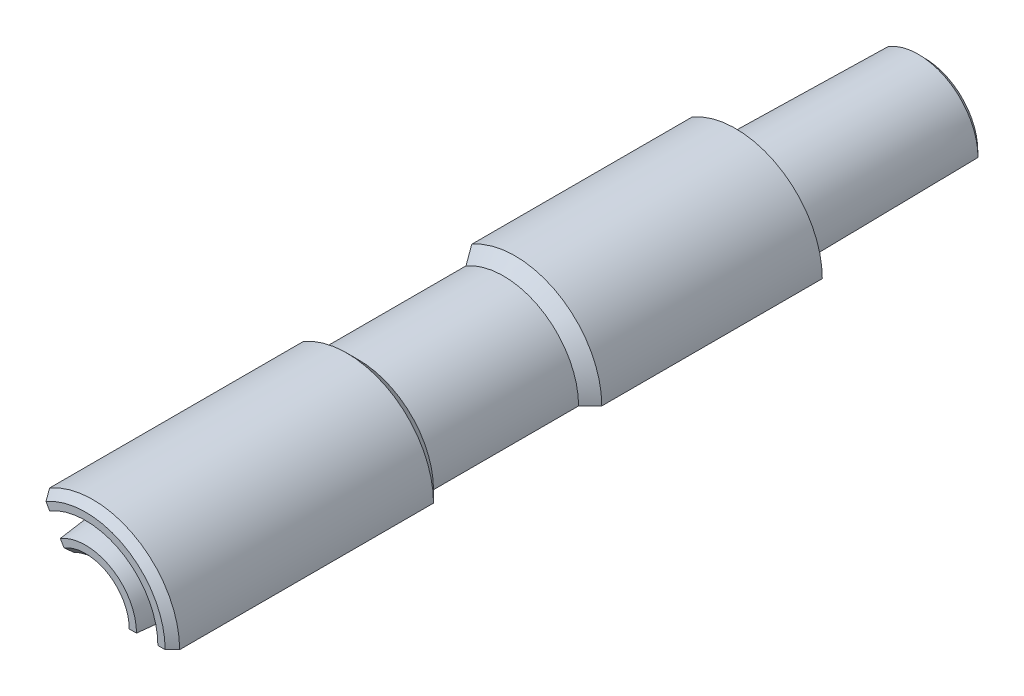
ISO-10303-21;
HEADER;
FILE_DESCRIPTION(('STEP AP214'),'2;1');
FILE_NAME('part.step','',(''),(''),'','','');
FILE_SCHEMA(('AUTOMOTIVE_DESIGN { 1 0 10303 214 1 1 1 1 }'));
ENDSEC;
DATA;
#1=APPLICATION_CONTEXT('core data for automotive mechanical design processes');
#2=APPLICATION_PROTOCOL_DEFINITION('international standard','automotive_design',2000,#1);
#3=PRODUCT_CONTEXT('',#1,'mechanical');
#4=PRODUCT('Part','Part','',(#3));
#5=PRODUCT_RELATED_PRODUCT_CATEGORY('part','',(#4));
#6=PRODUCT_DEFINITION_FORMATION('','',#4);
#7=PRODUCT_DEFINITION_CONTEXT('part definition',#1,'design');
#8=PRODUCT_DEFINITION('design','',#6,#7);
#9=PRODUCT_DEFINITION_SHAPE('','',#8);
#10=(LENGTH_UNIT() NAMED_UNIT(*) SI_UNIT(.MILLI.,.METRE.));
#11=(NAMED_UNIT(*) PLANE_ANGLE_UNIT() SI_UNIT($,.RADIAN.));
#12=(NAMED_UNIT(*) SI_UNIT($,.STERADIAN.) SOLID_ANGLE_UNIT());
#13=UNCERTAINTY_MEASURE_WITH_UNIT(LENGTH_MEASURE(1.E-05),#10,'distance_accuracy_value','');
#14=(GEOMETRIC_REPRESENTATION_CONTEXT(3) GLOBAL_UNCERTAINTY_ASSIGNED_CONTEXT((#13)) GLOBAL_UNIT_ASSIGNED_CONTEXT((#10,
#11,#12)) REPRESENTATION_CONTEXT('',''));
#15=CARTESIAN_POINT('',(0.,0.,0.));
#16=DIRECTION('',(0.,0.,1.));
#17=DIRECTION('',(1.,0.,0.));
#18=AXIS2_PLACEMENT_3D('',#15,#16,#17);
#19=CARTESIAN_POINT('',(0.,0.,19.425));
#20=DIRECTION('',(0.,0.,1.));
#21=DIRECTION('',(1.,0.,0.));
#22=AXIS2_PLACEMENT_3D('',#19,#20,#21);
#23=CONICAL_SURFACE('',#22,2.525,0.785398163397447);
#24=CARTESIAN_POINT('',(0.,0.,19.425));
#25=DIRECTION('',(0.,0.,-1.));
#26=DIRECTION('',(-1.,0.,0.));
#27=AXIS2_PLACEMENT_3D('',#24,#25,#26);
#28=CIRCLE('',#27,2.525);
#29=CARTESIAN_POINT('',(-1.26250000000001,2.1867141445557,19.425));
#30=VERTEX_POINT('',#29);
#31=CARTESIAN_POINT('',(2.525,0.,19.425));
#32=VERTEX_POINT('',#31);
#33=EDGE_CURVE('E246',#30,#32,#28,.T.);
#34=ORIENTED_EDGE('',*,*,#33,.T.);
#35=DIRECTION('',(0.707106781186547,0.,0.707106781186548));
#36=VECTOR('',#35,1.);
#37=CARTESIAN_POINT('',(3.,0.,19.9));
#38=LINE('',#37,#36);
#39=CARTESIAN_POINT('',(3.,0.,19.9));
#40=VERTEX_POINT('',#39);
#41=EDGE_CURVE('E241',#32,#40,#38,.T.);
#42=ORIENTED_EDGE('',*,*,#41,.T.);
#43=CARTESIAN_POINT('',(0.,0.,19.9));
#44=DIRECTION('',(0.,0.,-1.));
#45=DIRECTION('',(-1.,0.,0.));
#46=AXIS2_PLACEMENT_3D('',#43,#44,#45);
#47=CIRCLE('',#46,3.);
#48=CARTESIAN_POINT('',(-1.50000000000001,2.59807621135331,19.9));
#49=VERTEX_POINT('',#48);
#50=EDGE_CURVE('E224',#49,#40,#47,.T.);
#51=ORIENTED_EDGE('',*,*,#50,.F.);
#52=DIRECTION('',(-0.353553390593276,0.612372435695792,0.707106781186549));
#53=VECTOR('',#52,1.);
#54=CARTESIAN_POINT('',(-1.50000000000001,2.59807621135331,19.9));
#55=LINE('',#54,#53);
#56=EDGE_CURVE('E319',#30,#49,#55,.T.);
#57=ORIENTED_EDGE('',*,*,#56,.F.);
#58=EDGE_LOOP('',(#34,#42,#51,#57));
#59=FACE_BOUND('',#58,.T.);
#60=ADVANCED_FACE('F33',(#59),#23,.F.);
#61=CARTESIAN_POINT('',(0.,0.,0.));
#62=DIRECTION('',(0.,0.,-1.));
#63=DIRECTION('',(-1.,0.,0.));
#64=AXIS2_PLACEMENT_3D('',#61,#62,#63);
#65=CYLINDRICAL_SURFACE('',#64,2.525);
#66=CARTESIAN_POINT('',(0.,0.,11.425));
#67=DIRECTION('',(0.,0.,-1.));
#68=DIRECTION('',(-1.,0.,0.));
#69=AXIS2_PLACEMENT_3D('',#66,#67,#68);
#70=CIRCLE('',#69,2.525);
#71=CARTESIAN_POINT('',(-1.26250000000001,2.1867141445557,11.425));
#72=VERTEX_POINT('',#71);
#73=CARTESIAN_POINT('',(2.525,0.,11.425));
#74=VERTEX_POINT('',#73);
#75=EDGE_CURVE('E438',#72,#74,#70,.T.);
#76=ORIENTED_EDGE('',*,*,#75,.T.);
#77=DIRECTION('',(0.,0.,1.));
#78=VECTOR('',#77,1.);
#79=CARTESIAN_POINT('',(2.525,0.,19.425));
#80=LINE('',#79,#78);
#81=EDGE_CURVE('E317',#74,#32,#80,.T.);
#82=ORIENTED_EDGE('',*,*,#81,.T.);
#83=ORIENTED_EDGE('',*,*,#33,.F.);
#84=DIRECTION('',(0.,0.,1.));
#85=VECTOR('',#84,1.);
#86=CARTESIAN_POINT('',(-1.26250000000001,2.1867141445557,19.425));
#87=LINE('',#86,#85);
#88=EDGE_CURVE('E236',#72,#30,#87,.T.);
#89=ORIENTED_EDGE('',*,*,#88,.F.);
#90=EDGE_LOOP('',(#76,#82,#83,#89));
#91=FACE_BOUND('',#90,.T.);
#92=ADVANCED_FACE('F514',(#91),#65,.F.);
#93=CARTESIAN_POINT('',(0.,0.,10.95));
#94=DIRECTION('',(0.,0.,-1.));
#95=DIRECTION('',(-1.,0.,0.));
#96=AXIS2_PLACEMENT_3D('',#93,#94,#95);
#97=CONICAL_SURFACE('',#96,3.,0.785398163397447);
#98=CARTESIAN_POINT('',(0.,0.,10.95));
#99=DIRECTION('',(0.,0.,-1.));
#100=DIRECTION('',(-1.,0.,0.));
#101=AXIS2_PLACEMENT_3D('',#98,#99,#100);
#102=CIRCLE('',#101,3.);
#103=CARTESIAN_POINT('',(-1.50000000000001,2.59807621135331,10.95));
#104=VERTEX_POINT('',#103);
#105=CARTESIAN_POINT('',(3.,0.,10.95));
#106=VERTEX_POINT('',#105);
#107=EDGE_CURVE('E436',#104,#106,#102,.T.);
#108=ORIENTED_EDGE('',*,*,#107,.T.);
#109=DIRECTION('',(-0.707106781186546,0.,0.707106781186549));
#110=VECTOR('',#109,1.);
#111=CARTESIAN_POINT('',(2.525,0.,11.425));
#112=LINE('',#111,#110);
#113=EDGE_CURVE('E314',#106,#74,#112,.T.);
#114=ORIENTED_EDGE('',*,*,#113,.T.);
#115=ORIENTED_EDGE('',*,*,#75,.F.);
#116=DIRECTION('',(0.353553390593276,-0.612372435695792,0.707106781186549));
#117=VECTOR('',#116,1.);
#118=CARTESIAN_POINT('',(-1.26250000000001,2.1867141445557,11.425));
#119=LINE('',#118,#117);
#120=EDGE_CURVE('E388',#104,#72,#119,.T.);
#121=ORIENTED_EDGE('',*,*,#120,.F.);
#122=EDGE_LOOP('',(#108,#114,#115,#121));
#123=FACE_BOUND('',#122,.T.);
#124=ADVANCED_FACE('F511',(#123),#97,.F.);
#125=CARTESIAN_POINT('',(0.,0.,0.));
#126=DIRECTION('',(0.,0.,-1.));
#127=DIRECTION('',(-1.,0.,0.));
#128=AXIS2_PLACEMENT_3D('',#125,#126,#127);
#129=CYLINDRICAL_SURFACE('',#128,3.);
#130=CARTESIAN_POINT('',(0.,0.,0.));
#131=DIRECTION('',(0.,0.,-1.));
#132=DIRECTION('',(-1.,0.,0.));
#133=AXIS2_PLACEMENT_3D('',#130,#131,#132);
#134=CIRCLE('',#133,3.);
#135=CARTESIAN_POINT('',(-1.50000000000001,2.59807621135331,0.));
#136=VERTEX_POINT('',#135);
#137=CARTESIAN_POINT('',(3.,0.,0.));
#138=VERTEX_POINT('',#137);
#139=EDGE_CURVE('E433',#136,#138,#134,.T.);
#140=ORIENTED_EDGE('',*,*,#139,.T.);
#141=DIRECTION('',(0.,0.,1.));
#142=VECTOR('',#141,1.);
#143=CARTESIAN_POINT('',(3.,0.,10.95));
#144=LINE('',#143,#142);
#145=EDGE_CURVE('E311',#138,#106,#144,.T.);
#146=ORIENTED_EDGE('',*,*,#145,.T.);
#147=ORIENTED_EDGE('',*,*,#107,.F.);
#148=DIRECTION('',(0.,0.,1.));
#149=VECTOR('',#148,1.);
#150=CARTESIAN_POINT('',(-1.50000000000001,2.59807621135331,10.95));
#151=LINE('',#150,#149);
#152=EDGE_CURVE('E385',#136,#104,#151,.T.);
#153=ORIENTED_EDGE('',*,*,#152,.F.);
#154=EDGE_LOOP('',(#140,#146,#147,#153));
#155=FACE_BOUND('',#154,.T.);
#156=ADVANCED_FACE('F507',(#155),#129,.F.);
#157=CARTESIAN_POINT('',(-2.05000000000002,3.55070415551619,0.));
#158=DIRECTION('',(0.,0.,1.));
#159=DIRECTION('',(1.,0.,0.));
#160=AXIS2_PLACEMENT_3D('',#157,#158,#159);
#161=PLANE('',#160);
#162=DIRECTION('',(0.500000000000004,-0.866025403784436,0.));
#163=VECTOR('',#162,1.);
#164=CARTESIAN_POINT('',(-2.05000000000002,3.55070415551619,0.));
#165=LINE('',#164,#163);
#166=CARTESIAN_POINT('',(-1.84642738758116,3.19810604777721,0.));
#167=VERTEX_POINT('',#166);
#168=EDGE_CURVE('E383',#167,#136,#165,.T.);
#169=ORIENTED_EDGE('',*,*,#168,.F.);
#170=CARTESIAN_POINT('',(0.,0.,0.));
#171=DIRECTION('',(0.,0.,1.));
#172=DIRECTION('',(1.,0.,0.));
#173=AXIS2_PLACEMENT_3D('',#170,#171,#172);
#174=CIRCLE('',#173,3.69285477516229);
#175=CARTESIAN_POINT('',(3.69285477516229,0.,0.));
#176=VERTEX_POINT('',#175);
#177=EDGE_CURVE('E441',#167,#176,#174,.F.);
#178=ORIENTED_EDGE('',*,*,#177,.T.);
#179=DIRECTION('',(-1.,0.,0.));
#180=VECTOR('',#179,1.);
#181=CARTESIAN_POINT('',(4.1,0.,0.));
#182=LINE('',#181,#180);
#183=EDGE_CURVE('E309',#176,#138,#182,.T.);
#184=ORIENTED_EDGE('',*,*,#183,.T.);
#185=ORIENTED_EDGE('',*,*,#139,.F.);
#186=EDGE_LOOP('',(#169,#178,#184,#185));
#187=FACE_BOUND('',#186,.T.);
#188=ADVANCED_FACE('F502',(#187),#161,.F.);
#189=CARTESIAN_POINT('',(0.,0.,19.));
#190=DIRECTION('',(0.,0.,1.));
#191=DIRECTION('',(1.,0.,0.));
#192=AXIS2_PLACEMENT_3D('',#189,#190,#191);
#193=CONICAL_SURFACE('',#192,4.43061608206356,0.0173990904791199);
#194=DIRECTION('',(-0.0173982126260838,0.,-0.99984863964373));
#195=VECTOR('',#194,1.);
#196=CARTESIAN_POINT('',(4.43061608206357,0.,19.));
#197=LINE('',#196,#195);
#198=CARTESIAN_POINT('',(4.43061608206357,0.,19.));
#199=VERTEX_POINT('',#198);
#200=CARTESIAN_POINT('',(4.10695928505044,0.,0.399939455857506));
#201=VERTEX_POINT('',#200);
#202=EDGE_CURVE('E306',#199,#201,#197,.T.);
#203=ORIENTED_EDGE('',*,*,#202,.T.);
#204=CARTESIAN_POINT('',(0.,0.,0.399939455857506));
#205=DIRECTION('',(0.,0.,-1.));
#206=DIRECTION('',(-1.,0.,0.));
#207=AXIS2_PLACEMENT_3D('',#204,#205,#206);
#208=CIRCLE('',#207,4.10695928505044);
#209=CARTESIAN_POINT('',(-2.05347964252524,3.55673107316205,0.399939455857523));
#210=VERTEX_POINT('',#209);
#211=EDGE_CURVE('E446',#201,#210,#208,.F.);
#212=ORIENTED_EDGE('',*,*,#211,.T.);
#213=DIRECTION('',(0.00869910631304177,-0.0150672941146316,-0.99984863964373));
#214=VECTOR('',#213,1.);
#215=CARTESIAN_POINT('',(-2.2153080410318,3.83702608148291,19.));
#216=LINE('',#215,#214);
#217=CARTESIAN_POINT('',(-2.2153080410318,3.83702608148291,19.));
#218=VERTEX_POINT('',#217);
#219=EDGE_CURVE('E380',#218,#210,#216,.T.);
#220=ORIENTED_EDGE('',*,*,#219,.F.);
#221=CARTESIAN_POINT('',(0.,0.,19.));
#222=DIRECTION('',(0.,0.,-1.));
#223=DIRECTION('',(-1.,0.,0.));
#224=AXIS2_PLACEMENT_3D('',#221,#222,#223);
#225=CIRCLE('',#224,4.43061608206356);
#226=EDGE_CURVE('E431',#218,#199,#225,.T.);
#227=ORIENTED_EDGE('',*,*,#226,.T.);
#228=EDGE_LOOP('',(#203,#212,#220,#227));
#229=FACE_BOUND('',#228,.T.);
#230=ADVANCED_FACE('F494',(#229),#193,.T.);
#231=CARTESIAN_POINT('',(-2.58750000000002,4.48168146458446,19.));
#232=DIRECTION('',(0.,0.,1.));
#233=DIRECTION('',(1.,0.,0.));
#234=AXIS2_PLACEMENT_3D('',#231,#232,#233);
#235=PLANE('',#234);
#236=CARTESIAN_POINT('',(0.,0.,19.));
#237=DIRECTION('',(0.,0.,-1.));
#238=DIRECTION('',(-1.,0.,0.));
#239=AXIS2_PLACEMENT_3D('',#236,#237,#238);
#240=CIRCLE('',#239,5.175);
#241=CARTESIAN_POINT('',(-2.58750000000002,4.48168146458446,19.));
#242=VERTEX_POINT('',#241);
#243=CARTESIAN_POINT('',(5.17500000000001,0.,19.));
#244=VERTEX_POINT('',#243);
#245=EDGE_CURVE('E429',#242,#244,#240,.T.);
#246=ORIENTED_EDGE('',*,*,#245,.T.);
#247=DIRECTION('',(-1.,0.,0.));
#248=VECTOR('',#247,1.);
#249=CARTESIAN_POINT('',(5.17500000000001,0.,19.));
#250=LINE('',#249,#248);
#251=EDGE_CURVE('E303',#244,#199,#250,.T.);
#252=ORIENTED_EDGE('',*,*,#251,.T.);
#253=ORIENTED_EDGE('',*,*,#226,.F.);
#254=DIRECTION('',(0.500000000000004,-0.866025403784436,0.));
#255=VECTOR('',#254,1.);
#256=CARTESIAN_POINT('',(-2.58750000000002,4.48168146458446,19.));
#257=LINE('',#256,#255);
#258=EDGE_CURVE('E377',#242,#218,#257,.T.);
#259=ORIENTED_EDGE('',*,*,#258,.F.);
#260=EDGE_LOOP('',(#246,#252,#253,#259));
#261=FACE_BOUND('',#260,.T.);
#262=ADVANCED_FACE('F489',(#261),#235,.F.);
#263=CARTESIAN_POINT('',(0.,0.,13.));
#264=DIRECTION('',(0.,0.,-1.));
#265=DIRECTION('',(-1.,0.,0.));
#266=AXIS2_PLACEMENT_3D('',#263,#264,#265);
#267=CONICAL_SURFACE('',#266,5.475,0.0499583957219427);
#268=CARTESIAN_POINT('',(0.,0.,13.));
#269=DIRECTION('',(0.,0.,-1.));
#270=DIRECTION('',(-1.,0.,0.));
#271=AXIS2_PLACEMENT_3D('',#268,#269,#270);
#272=CIRCLE('',#271,5.475);
#273=CARTESIAN_POINT('',(-2.73750000000002,4.74148908571979,13.));
#274=VERTEX_POINT('',#273);
#275=CARTESIAN_POINT('',(5.47500000000001,0.,13.));
#276=VERTEX_POINT('',#275);
#277=EDGE_CURVE('E427',#274,#276,#272,.T.);
#278=ORIENTED_EDGE('',*,*,#277,.T.);
#279=DIRECTION('',(-0.0499376169438923,0.,0.998752338877845));
#280=VECTOR('',#279,1.);
#281=CARTESIAN_POINT('',(5.47500000000001,0.,13.));
#282=LINE('',#281,#280);
#283=EDGE_CURVE('E300',#276,#244,#282,.T.);
#284=ORIENTED_EDGE('',*,*,#283,.T.);
#285=ORIENTED_EDGE('',*,*,#245,.F.);
#286=DIRECTION('',(0.0249688084719465,-0.043247244877867,0.998752338877845));
#287=VECTOR('',#286,1.);
#288=CARTESIAN_POINT('',(-2.73750000000002,4.74148908571979,13.));
#289=LINE('',#288,#287);
#290=EDGE_CURVE('E374',#274,#242,#289,.T.);
#291=ORIENTED_EDGE('',*,*,#290,.F.);
#292=EDGE_LOOP('',(#278,#284,#285,#291));
#293=FACE_BOUND('',#292,.T.);
#294=ADVANCED_FACE('F486',(#293),#267,.F.);
#295=CARTESIAN_POINT('',(-2.98750000000002,5.17450178761201,13.));
#296=DIRECTION('',(0.,0.,1.));
#297=DIRECTION('',(1.,0.,0.));
#298=AXIS2_PLACEMENT_3D('',#295,#296,#297);
#299=PLANE('',#298);
#300=CARTESIAN_POINT('',(0.,0.,13.));
#301=DIRECTION('',(0.,0.,-1.));
#302=DIRECTION('',(-1.,0.,0.));
#303=AXIS2_PLACEMENT_3D('',#300,#301,#302);
#304=CIRCLE('',#303,5.975);
#305=CARTESIAN_POINT('',(-2.98750000000002,5.17450178761201,13.));
#306=VERTEX_POINT('',#305);
#307=CARTESIAN_POINT('',(5.97500000000001,0.,13.));
#308=VERTEX_POINT('',#307);
#309=EDGE_CURVE('E425',#306,#308,#304,.T.);
#310=ORIENTED_EDGE('',*,*,#309,.T.);
#311=DIRECTION('',(-1.,0.,0.));
#312=VECTOR('',#311,1.);
#313=CARTESIAN_POINT('',(5.97500000000001,0.,13.));
#314=LINE('',#313,#312);
#315=EDGE_CURVE('E297',#308,#276,#314,.T.);
#316=ORIENTED_EDGE('',*,*,#315,.T.);
#317=ORIENTED_EDGE('',*,*,#277,.F.);
#318=DIRECTION('',(0.500000000000004,-0.866025403784436,0.));
#319=VECTOR('',#318,1.);
#320=CARTESIAN_POINT('',(-2.98750000000002,5.17450178761201,13.));
#321=LINE('',#320,#319);
#322=EDGE_CURVE('E371',#306,#274,#321,.T.);
#323=ORIENTED_EDGE('',*,*,#322,.F.);
#324=EDGE_LOOP('',(#310,#316,#317,#323));
#325=FACE_BOUND('',#324,.T.);
#326=ADVANCED_FACE('F481',(#325),#299,.F.);
#327=CARTESIAN_POINT('',(0.,0.,0.));
#328=DIRECTION('',(0.,0.,-1.));
#329=DIRECTION('',(-1.,0.,0.));
#330=AXIS2_PLACEMENT_3D('',#327,#328,#329);
#331=CYLINDRICAL_SURFACE('',#330,5.975);
#332=CARTESIAN_POINT('',(0.,0.,28.2));
#333=DIRECTION('',(0.,0.,-1.));
#334=DIRECTION('',(-1.,0.,0.));
#335=AXIS2_PLACEMENT_3D('',#332,#333,#334);
#336=CIRCLE('',#335,5.975);
#337=CARTESIAN_POINT('',(-2.98750000000002,5.17450178761201,28.2));
#338=VERTEX_POINT('',#337);
#339=CARTESIAN_POINT('',(5.97500000000001,0.,28.2));
#340=VERTEX_POINT('',#339);
#341=EDGE_CURVE('E423',#338,#340,#336,.T.);
#342=ORIENTED_EDGE('',*,*,#341,.T.);
#343=DIRECTION('',(0.,0.,-1.));
#344=VECTOR('',#343,1.);
#345=CARTESIAN_POINT('',(5.97500000000001,0.,28.2));
#346=LINE('',#345,#344);
#347=EDGE_CURVE('E294',#340,#308,#346,.T.);
#348=ORIENTED_EDGE('',*,*,#347,.T.);
#349=ORIENTED_EDGE('',*,*,#309,.F.);
#350=DIRECTION('',(0.,0.,-1.));
#351=VECTOR('',#350,1.);
#352=CARTESIAN_POINT('',(-2.98750000000002,5.17450178761201,28.2));
#353=LINE('',#352,#351);
#354=EDGE_CURVE('E368',#338,#306,#353,.T.);
#355=ORIENTED_EDGE('',*,*,#354,.F.);
#356=EDGE_LOOP('',(#342,#348,#349,#355));
#357=FACE_BOUND('',#356,.T.);
#358=ADVANCED_FACE('F478',(#357),#331,.T.);
#359=CARTESIAN_POINT('',(0.,0.,29.));
#360=DIRECTION('',(0.,0.,-1.));
#361=DIRECTION('',(-1.,0.,0.));
#362=AXIS2_PLACEMENT_3D('',#359,#360,#361);
#363=CONICAL_SURFACE('',#362,5.175,0.78539816339745);
#364=CARTESIAN_POINT('',(0.,0.,29.));
#365=DIRECTION('',(0.,0.,-1.));
#366=DIRECTION('',(-1.,0.,0.));
#367=AXIS2_PLACEMENT_3D('',#364,#365,#366);
#368=CIRCLE('',#367,5.175);
#369=CARTESIAN_POINT('',(-2.58750000000002,4.48168146458446,29.));
#370=VERTEX_POINT('',#369);
#371=CARTESIAN_POINT('',(5.17500000000001,0.,29.));
#372=VERTEX_POINT('',#371);
#373=EDGE_CURVE('E421',#370,#372,#368,.T.);
#374=ORIENTED_EDGE('',*,*,#373,.T.);
#375=DIRECTION('',(0.707106781186549,0.,-0.707106781186546));
#376=VECTOR('',#375,1.);
#377=CARTESIAN_POINT('',(5.17500000000001,0.,29.));
#378=LINE('',#377,#376);
#379=EDGE_CURVE('E291',#372,#340,#378,.T.);
#380=ORIENTED_EDGE('',*,*,#379,.T.);
#381=ORIENTED_EDGE('',*,*,#341,.F.);
#382=DIRECTION('',(-0.353553390593277,0.612372435695794,-0.707106781186546));
#383=VECTOR('',#382,1.);
#384=CARTESIAN_POINT('',(-2.58750000000002,4.48168146458446,29.));
#385=LINE('',#384,#383);
#386=EDGE_CURVE('E365',#370,#338,#385,.T.);
#387=ORIENTED_EDGE('',*,*,#386,.F.);
#388=EDGE_LOOP('',(#374,#380,#381,#387));
#389=FACE_BOUND('',#388,.T.);
#390=ADVANCED_FACE('F473',(#389),#363,.T.);
#391=CARTESIAN_POINT('',(0.,0.,0.));
#392=DIRECTION('',(0.,0.,-1.));
#393=DIRECTION('',(-1.,0.,0.));
#394=AXIS2_PLACEMENT_3D('',#391,#392,#393);
#395=CYLINDRICAL_SURFACE('',#394,5.175);
#396=CARTESIAN_POINT('',(0.,0.,39.));
#397=DIRECTION('',(0.,0.,-1.));
#398=DIRECTION('',(-1.,0.,0.));
#399=AXIS2_PLACEMENT_3D('',#396,#397,#398);
#400=CIRCLE('',#399,5.175);
#401=CARTESIAN_POINT('',(-2.58750000000002,4.48168146458446,39.));
#402=VERTEX_POINT('',#401);
#403=CARTESIAN_POINT('',(5.17500000000001,0.,39.));
#404=VERTEX_POINT('',#403);
#405=EDGE_CURVE('E419',#402,#404,#400,.T.);
#406=ORIENTED_EDGE('',*,*,#405,.T.);
#407=DIRECTION('',(0.,0.,-1.));
#408=VECTOR('',#407,1.);
#409=CARTESIAN_POINT('',(5.17500000000001,0.,39.));
#410=LINE('',#409,#408);
#411=EDGE_CURVE('E288',#404,#372,#410,.T.);
#412=ORIENTED_EDGE('',*,*,#411,.T.);
#413=ORIENTED_EDGE('',*,*,#373,.F.);
#414=DIRECTION('',(0.,0.,-1.));
#415=VECTOR('',#414,1.);
#416=CARTESIAN_POINT('',(-2.58750000000002,4.48168146458446,39.));
#417=LINE('',#416,#415);
#418=EDGE_CURVE('E362',#402,#370,#417,.T.);
#419=ORIENTED_EDGE('',*,*,#418,.F.);
#420=EDGE_LOOP('',(#406,#412,#413,#419));
#421=FACE_BOUND('',#420,.T.);
#422=ADVANCED_FACE('F471',(#421),#395,.T.);
#423=CARTESIAN_POINT('',(0.,0.,39.8));
#424=DIRECTION('',(0.,0.,1.));
#425=DIRECTION('',(1.,0.,0.));
#426=AXIS2_PLACEMENT_3D('',#423,#424,#425);
#427=CONICAL_SURFACE('',#426,5.975,0.785398163397452);
#428=CARTESIAN_POINT('',(0.,0.,39.8));
#429=DIRECTION('',(0.,0.,-1.));
#430=DIRECTION('',(-1.,0.,0.));
#431=AXIS2_PLACEMENT_3D('',#428,#429,#430);
#432=CIRCLE('',#431,5.975);
#433=CARTESIAN_POINT('',(-2.98750000000002,5.17450178761201,39.8));
#434=VERTEX_POINT('',#433);
#435=CARTESIAN_POINT('',(5.97500000000001,0.,39.8));
#436=VERTEX_POINT('',#435);
#437=EDGE_CURVE('E416',#434,#436,#432,.T.);
#438=ORIENTED_EDGE('',*,*,#437,.T.);
#439=DIRECTION('',(-0.70710678118655,0.,-0.707106781186545));
#440=VECTOR('',#439,1.);
#441=CARTESIAN_POINT('',(5.97500000000001,0.,39.8));
#442=LINE('',#441,#440);
#443=EDGE_CURVE('E285',#436,#404,#442,.T.);
#444=ORIENTED_EDGE('',*,*,#443,.T.);
#445=ORIENTED_EDGE('',*,*,#405,.F.);
#446=DIRECTION('',(0.353553390593278,-0.612372435695795,-0.707106781186545));
#447=VECTOR('',#446,1.);
#448=CARTESIAN_POINT('',(-2.98750000000002,5.17450178761201,39.8));
#449=LINE('',#448,#447);
#450=EDGE_CURVE('E359',#434,#402,#449,.T.);
#451=ORIENTED_EDGE('',*,*,#450,.F.);
#452=EDGE_LOOP('',(#438,#444,#445,#451));
#453=FACE_BOUND('',#452,.T.);
#454=ADVANCED_FACE('F464',(#453),#427,.T.);
#455=CARTESIAN_POINT('',(0.,0.,0.));
#456=DIRECTION('',(0.,0.,-1.));
#457=DIRECTION('',(-1.,0.,0.));
#458=AXIS2_PLACEMENT_3D('',#455,#456,#457);
#459=CYLINDRICAL_SURFACE('',#458,5.975);
#460=DIRECTION('',(0.,0.,-1.));
#461=VECTOR('',#460,1.);
#462=CARTESIAN_POINT('',(-2.98750000000002,5.17450178761201,57.8));
#463=LINE('',#462,#461);
#464=CARTESIAN_POINT('',(-2.98750000000002,5.17450178761201,57.3));
#465=VERTEX_POINT('',#464);
#466=EDGE_CURVE('E357',#465,#434,#463,.T.);
#467=ORIENTED_EDGE('',*,*,#466,.F.);
#468=CARTESIAN_POINT('',(0.,0.,57.3));
#469=DIRECTION('',(0.,0.,-1.));
#470=DIRECTION('',(-1.,0.,0.));
#471=AXIS2_PLACEMENT_3D('',#468,#469,#470);
#472=CIRCLE('',#471,5.975);
#473=CARTESIAN_POINT('',(5.97500000000001,0.,57.3));
#474=VERTEX_POINT('',#473);
#475=EDGE_CURVE('E450',#465,#474,#472,.T.);
#476=ORIENTED_EDGE('',*,*,#475,.T.);
#477=DIRECTION('',(0.,0.,-1.));
#478=VECTOR('',#477,1.);
#479=CARTESIAN_POINT('',(5.97500000000001,0.,57.8));
#480=LINE('',#479,#478);
#481=EDGE_CURVE('E283',#474,#436,#480,.T.);
#482=ORIENTED_EDGE('',*,*,#481,.T.);
#483=ORIENTED_EDGE('',*,*,#437,.F.);
#484=EDGE_LOOP('',(#467,#476,#482,#483));
#485=FACE_BOUND('',#484,.T.);
#486=ADVANCED_FACE('F456',(#485),#459,.T.);
#487=CARTESIAN_POINT('',(-2.48750000000001,4.30847638382757,57.8));
#488=DIRECTION('',(0.,0.,-1.));
#489=DIRECTION('',(-1.,0.,0.));
#490=AXIS2_PLACEMENT_3D('',#487,#488,#489);
#491=PLANE('',#490);
#492=DIRECTION('',(1.,0.,0.));
#493=VECTOR('',#492,1.);
#494=CARTESIAN_POINT('',(4.97500000000001,0.,57.8));
#495=LINE('',#494,#493);
#496=CARTESIAN_POINT('',(4.97500000000001,0.,57.8));
#497=VERTEX_POINT('',#496);
#498=CARTESIAN_POINT('',(5.47500000000001,0.,57.8));
#499=VERTEX_POINT('',#498);
#500=EDGE_CURVE('E281',#497,#499,#495,.T.);
#501=ORIENTED_EDGE('',*,*,#500,.T.);
#502=CARTESIAN_POINT('',(0.,0.,57.8));
#503=DIRECTION('',(0.,0.,-1.));
#504=DIRECTION('',(-1.,0.,0.));
#505=AXIS2_PLACEMENT_3D('',#502,#503,#504);
#506=CIRCLE('',#505,5.475);
#507=CARTESIAN_POINT('',(-2.73750000000001,4.74148908571979,57.8));
#508=VERTEX_POINT('',#507);
#509=EDGE_CURVE('E41',#499,#508,#506,.F.);
#510=ORIENTED_EDGE('',*,*,#509,.T.);
#511=DIRECTION('',(-0.500000000000004,0.866025403784436,0.));
#512=VECTOR('',#511,1.);
#513=CARTESIAN_POINT('',(-2.48750000000001,4.30847638382757,57.8));
#514=LINE('',#513,#512);
#515=CARTESIAN_POINT('',(-2.48750000000001,4.30847638382757,57.8));
#516=VERTEX_POINT('',#515);
#517=EDGE_CURVE('E355',#516,#508,#514,.T.);
#518=ORIENTED_EDGE('',*,*,#517,.F.);
#519=CARTESIAN_POINT('',(0.,0.,57.8));
#520=DIRECTION('',(0.,0.,-1.));
#521=DIRECTION('',(-1.,0.,0.));
#522=AXIS2_PLACEMENT_3D('',#519,#520,#521);
#523=CIRCLE('',#522,4.975);
#524=EDGE_CURVE('E414',#516,#497,#523,.T.);
#525=ORIENTED_EDGE('',*,*,#524,.T.);
#526=EDGE_LOOP('',(#501,#510,#518,#525));
#527=FACE_BOUND('',#526,.T.);
#528=ADVANCED_FACE('F557',(#527),#491,.F.);
#529=CARTESIAN_POINT('',(0.,0.,53.8));
#530=DIRECTION('',(0.,0.,1.));
#531=DIRECTION('',(1.,0.,0.));
#532=AXIS2_PLACEMENT_3D('',#529,#530,#531);
#533=CONICAL_SURFACE('',#532,4.64422155192051,0.0825068821031021);
#534=CARTESIAN_POINT('',(0.,0.,53.8));
#535=DIRECTION('',(0.,0.,-1.));
#536=DIRECTION('',(-1.,0.,0.));
#537=AXIS2_PLACEMENT_3D('',#534,#535,#536);
#538=CIRCLE('',#537,4.64422155192051);
#539=CARTESIAN_POINT('',(-2.32211077596027,4.02201384476634,53.8));
#540=VERTEX_POINT('',#539);
#541=CARTESIAN_POINT('',(4.64422155192052,0.,53.8));
#542=VERTEX_POINT('',#541);
#543=EDGE_CURVE('E412',#540,#542,#538,.T.);
#544=ORIENTED_EDGE('',*,*,#543,.T.);
#545=DIRECTION('',(0.0824133045995778,0.,0.99659823761884));
#546=VECTOR('',#545,1.);
#547=CARTESIAN_POINT('',(4.64422155192052,0.,53.8));
#548=LINE('',#547,#546);
#549=EDGE_CURVE('E278',#542,#497,#548,.T.);
#550=ORIENTED_EDGE('',*,*,#549,.T.);
#551=ORIENTED_EDGE('',*,*,#524,.F.);
#552=DIRECTION('',(-0.041206652299789,0.071372015393059,0.99659823761884));
#553=VECTOR('',#552,1.);
#554=CARTESIAN_POINT('',(-2.32211077596027,4.02201384476634,53.8));
#555=LINE('',#554,#553);
#556=EDGE_CURVE('E352',#540,#516,#555,.T.);
#557=ORIENTED_EDGE('',*,*,#556,.F.);
#558=EDGE_LOOP('',(#544,#550,#551,#557));
#559=FACE_BOUND('',#558,.T.);
#560=ADVANCED_FACE('F556',(#559),#533,.F.);
#561=CARTESIAN_POINT('',(-1.98019952593154,3.4298061880372,53.8));
#562=DIRECTION('',(0.,0.,-1.));
#563=DIRECTION('',(-1.,0.,0.));
#564=AXIS2_PLACEMENT_3D('',#561,#562,#563);
#565=PLANE('',#564);
#566=CARTESIAN_POINT('',(0.,0.,53.8));
#567=DIRECTION('',(0.,0.,-1.));
#568=DIRECTION('',(-1.,0.,0.));
#569=AXIS2_PLACEMENT_3D('',#566,#567,#568);
#570=CIRCLE('',#569,3.96039905186305);
#571=CARTESIAN_POINT('',(-1.98019952593154,3.4298061880372,53.8));
#572=VERTEX_POINT('',#571);
#573=CARTESIAN_POINT('',(3.96039905186306,0.,53.8));
#574=VERTEX_POINT('',#573);
#575=EDGE_CURVE('E410',#572,#574,#570,.T.);
#576=ORIENTED_EDGE('',*,*,#575,.T.);
#577=DIRECTION('',(1.,0.,0.));
#578=VECTOR('',#577,1.);
#579=CARTESIAN_POINT('',(3.96039905186306,0.,53.8));
#580=LINE('',#579,#578);
#581=EDGE_CURVE('E275',#574,#542,#580,.T.);
#582=ORIENTED_EDGE('',*,*,#581,.T.);
#583=ORIENTED_EDGE('',*,*,#543,.F.);
#584=DIRECTION('',(-0.500000000000004,0.866025403784436,0.));
#585=VECTOR('',#584,1.);
#586=CARTESIAN_POINT('',(-1.98019952593154,3.4298061880372,53.8));
#587=LINE('',#586,#585);
#588=EDGE_CURVE('E349',#572,#540,#587,.T.);
#589=ORIENTED_EDGE('',*,*,#588,.F.);
#590=EDGE_LOOP('',(#576,#582,#583,#589));
#591=FACE_BOUND('',#590,.T.);
#592=ADVANCED_FACE('F552',(#591),#565,.F.);
#593=CARTESIAN_POINT('',(0.,0.,57.8));
#594=DIRECTION('',(0.,0.,-1.));
#595=DIRECTION('',(-1.,0.,0.));
#596=AXIS2_PLACEMENT_3D('',#593,#594,#595);
#597=CONICAL_SURFACE('',#596,3.5,0.114595486473674);
#598=CARTESIAN_POINT('',(0.,0.,57.8));
#599=DIRECTION('',(0.,0.,-1.));
#600=DIRECTION('',(-1.,0.,0.));
#601=AXIS2_PLACEMENT_3D('',#598,#599,#600);
#602=CIRCLE('',#601,3.5);
#603=CARTESIAN_POINT('',(-1.75000000000001,3.03108891324553,57.8));
#604=VERTEX_POINT('',#603);
#605=CARTESIAN_POINT('',(3.50000000000001,0.,57.8));
#606=VERTEX_POINT('',#605);
#607=EDGE_CURVE('E408',#604,#606,#602,.T.);
#608=ORIENTED_EDGE('',*,*,#607,.T.);
#609=DIRECTION('',(0.114344837389317,0.,-0.99344111962532));
#610=VECTOR('',#609,1.);
#611=CARTESIAN_POINT('',(3.50000000000001,0.,57.8));
#612=LINE('',#611,#610);
#613=EDGE_CURVE('E272',#606,#574,#612,.T.);
#614=ORIENTED_EDGE('',*,*,#613,.T.);
#615=ORIENTED_EDGE('',*,*,#575,.F.);
#616=DIRECTION('',(-0.0571724186946592,0.0990255339707492,-0.99344111962532));
#617=VECTOR('',#616,1.);
#618=CARTESIAN_POINT('',(-1.75000000000001,3.03108891324553,57.8));
#619=LINE('',#618,#617);
#620=EDGE_CURVE('E346',#604,#572,#619,.T.);
#621=ORIENTED_EDGE('',*,*,#620,.F.);
#622=EDGE_LOOP('',(#608,#614,#615,#621));
#623=FACE_BOUND('',#622,.T.);
#624=ADVANCED_FACE('F549',(#623),#597,.T.);
#625=CARTESIAN_POINT('',(-1.50000000000001,2.59807621135331,57.8));
#626=DIRECTION('',(0.,0.,-1.));
#627=DIRECTION('',(-1.,0.,0.));
#628=AXIS2_PLACEMENT_3D('',#625,#626,#627);
#629=PLANE('',#628);
#630=CARTESIAN_POINT('',(0.,0.,57.8));
#631=DIRECTION('',(0.,0.,-1.));
#632=DIRECTION('',(-1.,0.,0.));
#633=AXIS2_PLACEMENT_3D('',#630,#631,#632);
#634=CIRCLE('',#633,3.);
#635=CARTESIAN_POINT('',(-1.50000000000001,2.59807621135331,57.8));
#636=VERTEX_POINT('',#635);
#637=CARTESIAN_POINT('',(3.00000000000001,0.,57.8));
#638=VERTEX_POINT('',#637);
#639=EDGE_CURVE('E406',#636,#638,#634,.T.);
#640=ORIENTED_EDGE('',*,*,#639,.T.);
#641=DIRECTION('',(1.,0.,0.));
#642=VECTOR('',#641,1.);
#643=CARTESIAN_POINT('',(3.00000000000001,0.,57.8));
#644=LINE('',#643,#642);
#645=EDGE_CURVE('E269',#638,#606,#644,.T.);
#646=ORIENTED_EDGE('',*,*,#645,.T.);
#647=ORIENTED_EDGE('',*,*,#607,.F.);
#648=DIRECTION('',(-0.500000000000004,0.866025403784436,0.));
#649=VECTOR('',#648,1.);
#650=CARTESIAN_POINT('',(-1.50000000000001,2.59807621135331,57.8));
#651=LINE('',#650,#649);
#652=EDGE_CURVE('E343',#636,#604,#651,.T.);
#653=ORIENTED_EDGE('',*,*,#652,.F.);
#654=EDGE_LOOP('',(#640,#646,#647,#653));
#655=FACE_BOUND('',#654,.T.);
#656=ADVANCED_FACE('F544',(#655),#629,.F.);
#657=CARTESIAN_POINT('',(0.,0.,57.325));
#658=DIRECTION('',(0.,0.,1.));
#659=DIRECTION('',(1.,0.,0.));
#660=AXIS2_PLACEMENT_3D('',#657,#658,#659);
#661=CONICAL_SURFACE('',#660,2.525,0.785398163397446);
#662=CARTESIAN_POINT('',(0.,0.,57.325));
#663=DIRECTION('',(0.,0.,-1.));
#664=DIRECTION('',(-1.,0.,0.));
#665=AXIS2_PLACEMENT_3D('',#662,#663,#664);
#666=CIRCLE('',#665,2.525);
#667=CARTESIAN_POINT('',(-1.2625,2.1867141445557,57.325));
#668=VERTEX_POINT('',#667);
#669=CARTESIAN_POINT('',(2.52500000000001,0.,57.325));
#670=VERTEX_POINT('',#669);
#671=EDGE_CURVE('E404',#668,#670,#666,.T.);
#672=ORIENTED_EDGE('',*,*,#671,.T.);
#673=DIRECTION('',(0.707106781186546,0.,0.70710678118655));
#674=VECTOR('',#673,1.);
#675=CARTESIAN_POINT('',(2.52500000000001,0.,57.325));
#676=LINE('',#675,#674);
#677=EDGE_CURVE('E266',#670,#638,#676,.T.);
#678=ORIENTED_EDGE('',*,*,#677,.T.);
#679=ORIENTED_EDGE('',*,*,#639,.F.);
#680=DIRECTION('',(-0.353553390593276,0.612372435695791,0.70710678118655));
#681=VECTOR('',#680,1.);
#682=CARTESIAN_POINT('',(-1.2625,2.1867141445557,57.325));
#683=LINE('',#682,#681);
#684=EDGE_CURVE('E340',#668,#636,#683,.T.);
#685=ORIENTED_EDGE('',*,*,#684,.F.);
#686=EDGE_LOOP('',(#672,#678,#679,#685));
#687=FACE_BOUND('',#686,.T.);
#688=ADVANCED_FACE('F541',(#687),#661,.F.);
#689=CARTESIAN_POINT('',(0.,0.,0.));
#690=DIRECTION('',(0.,0.,-1.));
#691=DIRECTION('',(-1.,0.,0.));
#692=AXIS2_PLACEMENT_3D('',#689,#690,#691);
#693=CYLINDRICAL_SURFACE('',#692,2.525);
#694=CARTESIAN_POINT('',(0.,0.,49.325));
#695=DIRECTION('',(0.,0.,-1.));
#696=DIRECTION('',(-1.,0.,0.));
#697=AXIS2_PLACEMENT_3D('',#694,#695,#696);
#698=CIRCLE('',#697,2.525);
#699=CARTESIAN_POINT('',(-1.2625,2.1867141445557,49.325));
#700=VERTEX_POINT('',#699);
#701=CARTESIAN_POINT('',(2.52500000000001,0.,49.325));
#702=VERTEX_POINT('',#701);
#703=EDGE_CURVE('E402',#700,#702,#698,.T.);
#704=ORIENTED_EDGE('',*,*,#703,.T.);
#705=DIRECTION('',(0.,0.,1.));
#706=VECTOR('',#705,1.);
#707=CARTESIAN_POINT('',(2.52500000000001,0.,49.325));
#708=LINE('',#707,#706);
#709=EDGE_CURVE('E263',#702,#670,#708,.T.);
#710=ORIENTED_EDGE('',*,*,#709,.T.);
#711=ORIENTED_EDGE('',*,*,#671,.F.);
#712=DIRECTION('',(0.,0.,1.));
#713=VECTOR('',#712,1.);
#714=CARTESIAN_POINT('',(-1.2625,2.1867141445557,49.325));
#715=LINE('',#714,#713);
#716=EDGE_CURVE('E337',#700,#668,#715,.T.);
#717=ORIENTED_EDGE('',*,*,#716,.F.);
#718=EDGE_LOOP('',(#704,#710,#711,#717));
#719=FACE_BOUND('',#718,.T.);
#720=ADVANCED_FACE('F536',(#719),#693,.F.);
#721=CARTESIAN_POINT('',(0.,0.,48.85));
#722=DIRECTION('',(0.,0.,-1.));
#723=DIRECTION('',(-1.,0.,0.));
#724=AXIS2_PLACEMENT_3D('',#721,#722,#723);
#725=CONICAL_SURFACE('',#724,3.,0.785398163397445);
#726=CARTESIAN_POINT('',(0.,0.,48.85));
#727=DIRECTION('',(0.,0.,-1.));
#728=DIRECTION('',(-1.,0.,0.));
#729=AXIS2_PLACEMENT_3D('',#726,#727,#728);
#730=CIRCLE('',#729,3.);
#731=CARTESIAN_POINT('',(-1.50000000000001,2.59807621135331,48.85));
#732=VERTEX_POINT('',#731);
#733=CARTESIAN_POINT('',(3.00000000000001,0.,48.85));
#734=VERTEX_POINT('',#733);
#735=EDGE_CURVE('E400',#732,#734,#730,.T.);
#736=ORIENTED_EDGE('',*,*,#735,.T.);
#737=DIRECTION('',(-0.707106781186545,0.,0.70710678118655));
#738=VECTOR('',#737,1.);
#739=CARTESIAN_POINT('',(3.00000000000001,0.,48.85));
#740=LINE('',#739,#738);
#741=EDGE_CURVE('E260',#734,#702,#740,.T.);
#742=ORIENTED_EDGE('',*,*,#741,.T.);
#743=ORIENTED_EDGE('',*,*,#703,.F.);
#744=DIRECTION('',(0.353553390593275,-0.612372435695791,0.70710678118655));
#745=VECTOR('',#744,1.);
#746=CARTESIAN_POINT('',(-1.50000000000001,2.59807621135331,48.85));
#747=LINE('',#746,#745);
#748=EDGE_CURVE('E334',#732,#700,#747,.T.);
#749=ORIENTED_EDGE('',*,*,#748,.F.);
#750=EDGE_LOOP('',(#736,#742,#743,#749));
#751=FACE_BOUND('',#750,.T.);
#752=ADVANCED_FACE('F533',(#751),#725,.F.);
#753=CARTESIAN_POINT('',(0.,0.,0.));
#754=DIRECTION('',(0.,0.,-1.));
#755=DIRECTION('',(-1.,0.,0.));
#756=AXIS2_PLACEMENT_3D('',#753,#754,#755);
#757=CYLINDRICAL_SURFACE('',#756,3.);
#758=CARTESIAN_POINT('',(0.,0.,38.85));
#759=DIRECTION('',(0.,0.,-1.));
#760=DIRECTION('',(-1.,0.,0.));
#761=AXIS2_PLACEMENT_3D('',#758,#759,#760);
#762=CIRCLE('',#761,3.);
#763=CARTESIAN_POINT('',(-1.50000000000001,2.59807621135331,38.85));
#764=VERTEX_POINT('',#763);
#765=CARTESIAN_POINT('',(3.,0.,38.85));
#766=VERTEX_POINT('',#765);
#767=EDGE_CURVE('E398',#764,#766,#762,.T.);
#768=ORIENTED_EDGE('',*,*,#767,.T.);
#769=DIRECTION('',(0.,0.,1.));
#770=VECTOR('',#769,1.);
#771=CARTESIAN_POINT('',(3.,0.,38.85));
#772=LINE('',#771,#770);
#773=EDGE_CURVE('E257',#766,#734,#772,.T.);
#774=ORIENTED_EDGE('',*,*,#773,.T.);
#775=ORIENTED_EDGE('',*,*,#735,.F.);
#776=DIRECTION('',(0.,0.,1.));
#777=VECTOR('',#776,1.);
#778=CARTESIAN_POINT('',(-1.50000000000001,2.59807621135331,38.85));
#779=LINE('',#778,#777);
#780=EDGE_CURVE('E331',#764,#732,#779,.T.);
#781=ORIENTED_EDGE('',*,*,#780,.F.);
#782=EDGE_LOOP('',(#768,#774,#775,#781));
#783=FACE_BOUND('',#782,.T.);
#784=ADVANCED_FACE('F528',(#783),#757,.F.);
#785=CARTESIAN_POINT('',(0.,0.,38.375));
#786=DIRECTION('',(0.,0.,1.));
#787=DIRECTION('',(1.,0.,0.));
#788=AXIS2_PLACEMENT_3D('',#785,#786,#787);
#789=CONICAL_SURFACE('',#788,2.525,0.785398163397452);
#790=CARTESIAN_POINT('',(0.,0.,38.375));
#791=DIRECTION('',(0.,0.,-1.));
#792=DIRECTION('',(-1.,0.,0.));
#793=AXIS2_PLACEMENT_3D('',#790,#791,#792);
#794=CIRCLE('',#793,2.525);
#795=CARTESIAN_POINT('',(-1.26250000000001,2.1867141445557,38.375));
#796=VERTEX_POINT('',#795);
#797=CARTESIAN_POINT('',(2.525,0.,38.375));
#798=VERTEX_POINT('',#797);
#799=EDGE_CURVE('E396',#796,#798,#794,.T.);
#800=ORIENTED_EDGE('',*,*,#799,.T.);
#801=DIRECTION('',(0.70710678118655,0.,0.707106781186545));
#802=VECTOR('',#801,1.);
#803=CARTESIAN_POINT('',(2.525,0.,38.375));
#804=LINE('',#803,#802);
#805=EDGE_CURVE('E254',#798,#766,#804,.T.);
#806=ORIENTED_EDGE('',*,*,#805,.T.);
#807=ORIENTED_EDGE('',*,*,#767,.F.);
#808=DIRECTION('',(-0.353553390593278,0.612372435695795,0.707106781186545));
#809=VECTOR('',#808,1.);
#810=CARTESIAN_POINT('',(-1.26250000000001,2.1867141445557,38.375));
#811=LINE('',#810,#809);
#812=EDGE_CURVE('E328',#796,#764,#811,.T.);
#813=ORIENTED_EDGE('',*,*,#812,.F.);
#814=EDGE_LOOP('',(#800,#806,#807,#813));
#815=FACE_BOUND('',#814,.T.);
#816=ADVANCED_FACE('F525',(#815),#789,.F.);
#817=CARTESIAN_POINT('',(0.,0.,0.));
#818=DIRECTION('',(0.,0.,-1.));
#819=DIRECTION('',(-1.,0.,0.));
#820=AXIS2_PLACEMENT_3D('',#817,#818,#819);
#821=CYLINDRICAL_SURFACE('',#820,2.525);
#822=CARTESIAN_POINT('',(0.,0.,30.375));
#823=DIRECTION('',(0.,0.,-1.));
#824=DIRECTION('',(-1.,0.,0.));
#825=AXIS2_PLACEMENT_3D('',#822,#823,#824);
#826=CIRCLE('',#825,2.525);
#827=CARTESIAN_POINT('',(-1.26250000000001,2.1867141445557,30.375));
#828=VERTEX_POINT('',#827);
#829=CARTESIAN_POINT('',(2.525,0.,30.375));
#830=VERTEX_POINT('',#829);
#831=EDGE_CURVE('E394',#828,#830,#826,.T.);
#832=ORIENTED_EDGE('',*,*,#831,.T.);
#833=DIRECTION('',(0.,0.,1.));
#834=VECTOR('',#833,1.);
#835=CARTESIAN_POINT('',(2.525,0.,30.375));
#836=LINE('',#835,#834);
#837=EDGE_CURVE('E251',#830,#798,#836,.T.);
#838=ORIENTED_EDGE('',*,*,#837,.T.);
#839=ORIENTED_EDGE('',*,*,#799,.F.);
#840=DIRECTION('',(0.,0.,1.));
#841=VECTOR('',#840,1.);
#842=CARTESIAN_POINT('',(-1.26250000000001,2.1867141445557,30.375));
#843=LINE('',#842,#841);
#844=EDGE_CURVE('E325',#828,#796,#843,.T.);
#845=ORIENTED_EDGE('',*,*,#844,.F.);
#846=EDGE_LOOP('',(#832,#838,#839,#845));
#847=FACE_BOUND('',#846,.T.);
#848=ADVANCED_FACE('F520',(#847),#821,.F.);
#849=CARTESIAN_POINT('',(0.,0.,29.9));
#850=DIRECTION('',(0.,0.,-1.));
#851=DIRECTION('',(-1.,0.,0.));
#852=AXIS2_PLACEMENT_3D('',#849,#850,#851);
#853=CONICAL_SURFACE('',#852,3.,0.785398163397445);
#854=CARTESIAN_POINT('',(0.,0.,29.9));
#855=DIRECTION('',(0.,0.,-1.));
#856=DIRECTION('',(-1.,0.,0.));
#857=AXIS2_PLACEMENT_3D('',#854,#855,#856);
#858=CIRCLE('',#857,3.);
#859=CARTESIAN_POINT('',(-1.50000000000001,2.59807621135331,29.9));
#860=VERTEX_POINT('',#859);
#861=CARTESIAN_POINT('',(3.,0.,29.9));
#862=VERTEX_POINT('',#861);
#863=EDGE_CURVE('E235',#860,#862,#858,.T.);
#864=ORIENTED_EDGE('',*,*,#863,.T.);
#865=DIRECTION('',(-0.707106781186545,0.,0.70710678118655));
#866=VECTOR('',#865,1.);
#867=CARTESIAN_POINT('',(2.525,0.,30.375));
#868=LINE('',#867,#866);
#869=EDGE_CURVE('E244',#862,#830,#868,.T.);
#870=ORIENTED_EDGE('',*,*,#869,.T.);
#871=ORIENTED_EDGE('',*,*,#831,.F.);
#872=DIRECTION('',(0.353553390593275,-0.612372435695791,0.70710678118655));
#873=VECTOR('',#872,1.);
#874=CARTESIAN_POINT('',(-1.26250000000001,2.1867141445557,30.375));
#875=LINE('',#874,#873);
#876=EDGE_CURVE('E322',#860,#828,#875,.T.);
#877=ORIENTED_EDGE('',*,*,#876,.F.);
#878=EDGE_LOOP('',(#864,#870,#871,#877));
#879=FACE_BOUND('',#878,.T.);
#880=ADVANCED_FACE('F518',(#879),#853,.F.);
#881=CARTESIAN_POINT('',(0.,0.,0.));
#882=DIRECTION('',(0.,0.,-1.));
#883=DIRECTION('',(-1.,0.,0.));
#884=AXIS2_PLACEMENT_3D('',#881,#882,#883);
#885=CYLINDRICAL_SURFACE('',#884,3.);
#886=DIRECTION('',(0.,0.,1.));
#887=VECTOR('',#886,1.);
#888=CARTESIAN_POINT('',(-1.50000000000001,2.59807621135331,29.9));
#889=LINE('',#888,#887);
#890=EDGE_CURVE('E230',#49,#860,#889,.T.);
#891=ORIENTED_EDGE('',*,*,#890,.F.);
#892=ORIENTED_EDGE('',*,*,#50,.T.);
#893=DIRECTION('',(0.,0.,1.));
#894=VECTOR('',#893,1.);
#895=CARTESIAN_POINT('',(3.,0.,29.9));
#896=LINE('',#895,#894);
#897=EDGE_CURVE('E227',#40,#862,#896,.T.);
#898=ORIENTED_EDGE('',*,*,#897,.T.);
#899=ORIENTED_EDGE('',*,*,#863,.F.);
#900=EDGE_LOOP('',(#891,#892,#898,#899));
#901=FACE_BOUND('',#900,.T.);
#902=ADVANCED_FACE('F226',(#901),#885,.F.);
#903=CARTESIAN_POINT('',(0.,0.,0.));
#904=DIRECTION('',(0.866025403784436,0.500000000000004,0.));
#905=DIRECTION('',(0.,0.,-1.));
#906=AXIS2_PLACEMENT_3D('',#903,#904,#905);
#907=PLANE('',#906);
#908=ORIENTED_EDGE('',*,*,#517,.T.);
#909=DIRECTION('',(0.353553390593279,-0.612372435695797,0.707106781186543));
#910=VECTOR('',#909,1.);
#911=CARTESIAN_POINT('',(0.,0.,63.2749999999999));
#912=LINE('',#911,#910);
#913=EDGE_CURVE('E11',#508,#465,#912,.F.);
#914=ORIENTED_EDGE('',*,*,#913,.T.);
#915=ORIENTED_EDGE('',*,*,#466,.T.);
#916=ORIENTED_EDGE('',*,*,#450,.T.);
#917=ORIENTED_EDGE('',*,*,#418,.T.);
#918=ORIENTED_EDGE('',*,*,#386,.T.);
#919=ORIENTED_EDGE('',*,*,#354,.T.);
#920=ORIENTED_EDGE('',*,*,#322,.T.);
#921=ORIENTED_EDGE('',*,*,#290,.T.);
#922=ORIENTED_EDGE('',*,*,#258,.T.);
#923=ORIENTED_EDGE('',*,*,#219,.T.);
#924=DIRECTION('',(-0.359651073690328,0.62293393262834,0.694697359123803));
#925=VECTOR('',#924,1.);
#926=CARTESIAN_POINT('',(0.,0.,-3.56653524429889));
#927=LINE('',#926,#925);
#928=EDGE_CURVE('E448',#210,#167,#927,.F.);
#929=ORIENTED_EDGE('',*,*,#928,.T.);
#930=ORIENTED_EDGE('',*,*,#168,.T.);
#931=ORIENTED_EDGE('',*,*,#152,.T.);
#932=ORIENTED_EDGE('',*,*,#120,.T.);
#933=ORIENTED_EDGE('',*,*,#88,.T.);
#934=ORIENTED_EDGE('',*,*,#56,.T.);
#935=ORIENTED_EDGE('',*,*,#890,.T.);
#936=ORIENTED_EDGE('',*,*,#876,.T.);
#937=ORIENTED_EDGE('',*,*,#844,.T.);
#938=ORIENTED_EDGE('',*,*,#812,.T.);
#939=ORIENTED_EDGE('',*,*,#780,.T.);
#940=ORIENTED_EDGE('',*,*,#748,.T.);
#941=ORIENTED_EDGE('',*,*,#716,.T.);
#942=ORIENTED_EDGE('',*,*,#684,.T.);
#943=ORIENTED_EDGE('',*,*,#652,.T.);
#944=ORIENTED_EDGE('',*,*,#620,.T.);
#945=ORIENTED_EDGE('',*,*,#588,.T.);
#946=ORIENTED_EDGE('',*,*,#556,.T.);
#947=EDGE_LOOP('',(#908,#914,#915,#916,#917,#918,#919,#920,#921,#922,#923,#929,#930,#931,#932,
#933,#934,#935,#936,#937,#938,#939,#940,#941,#942,#943,#944,#945,#946));
#948=FACE_BOUND('',#947,.T.);
#949=ADVANCED_FACE('F468',(#948),#907,.F.);
#950=CARTESIAN_POINT('',(0.,0.,0.));
#951=DIRECTION('',(0.,-1.,0.));
#952=DIRECTION('',(0.,0.,-1.));
#953=AXIS2_PLACEMENT_3D('',#950,#951,#952);
#954=PLANE('',#953);
#955=ORIENTED_EDGE('',*,*,#481,.F.);
#956=DIRECTION('',(-0.707106781186552,0.,0.707106781186543));
#957=VECTOR('',#956,1.);
#958=CARTESIAN_POINT('',(0.,0.,63.2749999999999));
#959=LINE('',#958,#957);
#960=EDGE_CURVE('E55',#474,#499,#959,.T.);
#961=ORIENTED_EDGE('',*,*,#960,.T.);
#962=ORIENTED_EDGE('',*,*,#500,.F.);
#963=ORIENTED_EDGE('',*,*,#549,.F.);
#964=ORIENTED_EDGE('',*,*,#581,.F.);
#965=ORIENTED_EDGE('',*,*,#613,.F.);
#966=ORIENTED_EDGE('',*,*,#645,.F.);
#967=ORIENTED_EDGE('',*,*,#677,.F.);
#968=ORIENTED_EDGE('',*,*,#709,.F.);
#969=ORIENTED_EDGE('',*,*,#741,.F.);
#970=ORIENTED_EDGE('',*,*,#773,.F.);
#971=ORIENTED_EDGE('',*,*,#805,.F.);
#972=ORIENTED_EDGE('',*,*,#837,.F.);
#973=ORIENTED_EDGE('',*,*,#869,.F.);
#974=ORIENTED_EDGE('',*,*,#897,.F.);
#975=ORIENTED_EDGE('',*,*,#41,.F.);
#976=ORIENTED_EDGE('',*,*,#81,.F.);
#977=ORIENTED_EDGE('',*,*,#113,.F.);
#978=ORIENTED_EDGE('',*,*,#145,.F.);
#979=ORIENTED_EDGE('',*,*,#183,.F.);
#980=DIRECTION('',(0.71930214738065,0.,0.694697359123802));
#981=VECTOR('',#980,1.);
#982=CARTESIAN_POINT('',(0.,0.,-3.56653524429889));
#983=LINE('',#982,#981);
#984=EDGE_CURVE('E444',#176,#201,#983,.T.);
#985=ORIENTED_EDGE('',*,*,#984,.T.);
#986=ORIENTED_EDGE('',*,*,#202,.F.);
#987=ORIENTED_EDGE('',*,*,#251,.F.);
#988=ORIENTED_EDGE('',*,*,#283,.F.);
#989=ORIENTED_EDGE('',*,*,#315,.F.);
#990=ORIENTED_EDGE('',*,*,#347,.F.);
#991=ORIENTED_EDGE('',*,*,#379,.F.);
#992=ORIENTED_EDGE('',*,*,#411,.F.);
#993=ORIENTED_EDGE('',*,*,#443,.F.);
#994=EDGE_LOOP('',(#955,#961,#962,#963,#964,#965,#966,#967,#968,#969,#970,#971,#972,#973,#974,
#975,#976,#977,#978,#979,#985,#986,#987,#988,#989,#990,#991,#992,#993));
#995=FACE_BOUND('',#994,.T.);
#996=ADVANCED_FACE('F239',(#995),#954,.T.);
#997=CARTESIAN_POINT('',(0.,0.,0.));
#998=DIRECTION('',(0.,0.,1.));
#999=DIRECTION('',(1.,0.,0.));
#1000=AXIS2_PLACEMENT_3D('',#997,#998,#999);
#1001=CONICAL_SURFACE('',#1000,3.69285477516229,0.802797253876561);
#1002=ORIENTED_EDGE('',*,*,#928,.F.);
#1003=ORIENTED_EDGE('',*,*,#211,.F.);
#1004=ORIENTED_EDGE('',*,*,#984,.F.);
#1005=ORIENTED_EDGE('',*,*,#177,.F.);
#1006=EDGE_LOOP('',(#1002,#1003,#1004,#1005));
#1007=FACE_BOUND('',#1006,.T.);
#1008=ADVANCED_FACE('F497',(#1007),#1001,.T.);
#1009=CARTESIAN_POINT('',(0.,0.,57.3));
#1010=DIRECTION('',(0.,0.,-1.));
#1011=DIRECTION('',(-1.,0.,0.));
#1012=AXIS2_PLACEMENT_3D('',#1009,#1010,#1011);
#1013=CONICAL_SURFACE('',#1012,5.975,0.785398163397455);
#1014=ORIENTED_EDGE('',*,*,#913,.F.);
#1015=ORIENTED_EDGE('',*,*,#509,.F.);
#1016=ORIENTED_EDGE('',*,*,#960,.F.);
#1017=ORIENTED_EDGE('',*,*,#475,.F.);
#1018=EDGE_LOOP('',(#1014,#1015,#1016,#1017));
#1019=FACE_BOUND('',#1018,.T.);
#1020=ADVANCED_FACE('F35',(#1019),#1013,.T.);
#1021=CLOSED_SHELL('',(#60,#92,#124,#156,#188,#230,#262,#294,#326,#358,#390,#422,#454,#486,#528,
#560,#592,#624,#656,#688,#720,#752,#784,#816,#848,#880,#902,#949,#996,#1008,#1020));
#1022=MANIFOLD_SOLID_BREP('B2',#1021);
#1023=ADVANCED_BREP_SHAPE_REPRESENTATION('',(#18,#1022),#14);
#1024=SHAPE_DEFINITION_REPRESENTATION(#9,#1023);
ENDSEC;
END-ISO-10303-21;
